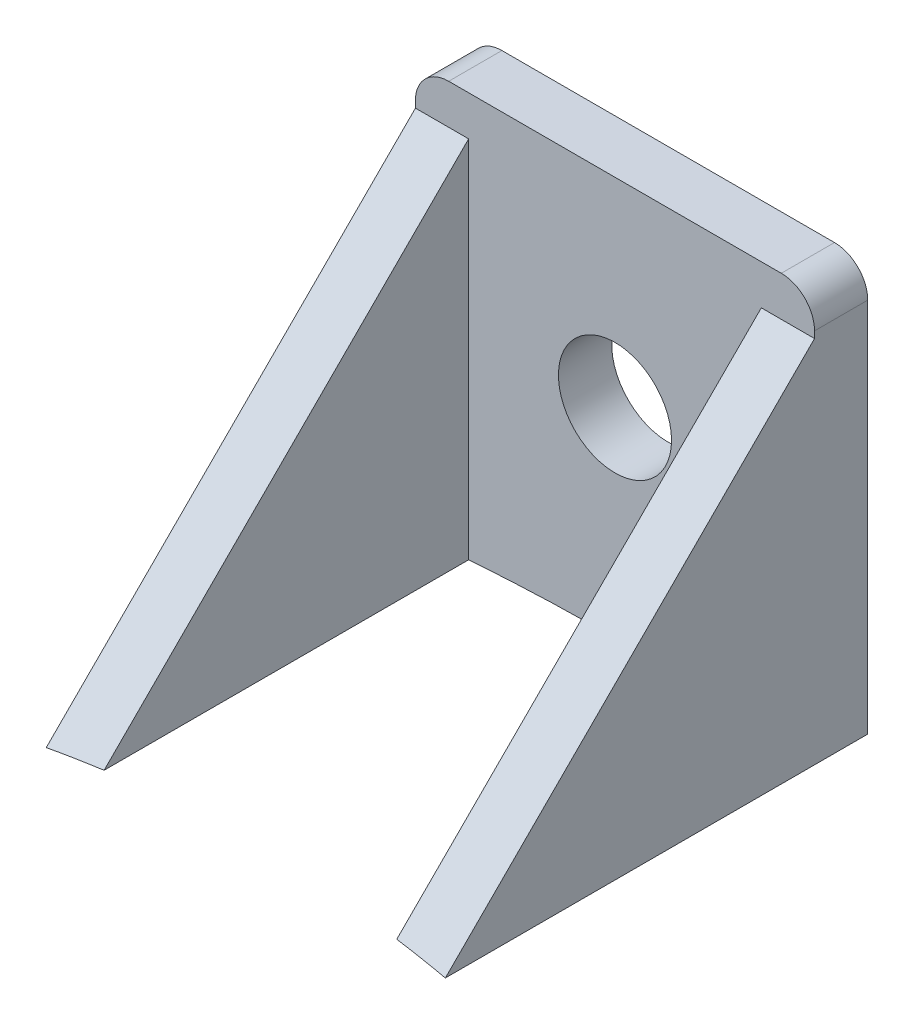
ISO-10303-21;
HEADER;
FILE_DESCRIPTION(('STEP AP214'),'2;1');
FILE_NAME('part.step','',(''),(''),'','','');
FILE_SCHEMA(('AUTOMOTIVE_DESIGN { 1 0 10303 214 1 1 1 1 }'));
ENDSEC;
DATA;
#1=APPLICATION_CONTEXT('core data for automotive mechanical design processes');
#2=APPLICATION_PROTOCOL_DEFINITION('international standard','automotive_design',2000,#1);
#3=PRODUCT_CONTEXT('',#1,'mechanical');
#4=PRODUCT('Part','Part','',(#3));
#5=PRODUCT_RELATED_PRODUCT_CATEGORY('part','',(#4));
#6=PRODUCT_DEFINITION_FORMATION('','',#4);
#7=PRODUCT_DEFINITION_CONTEXT('part definition',#1,'design');
#8=PRODUCT_DEFINITION('design','',#6,#7);
#9=PRODUCT_DEFINITION_SHAPE('','',#8);
#10=(LENGTH_UNIT() NAMED_UNIT(*) SI_UNIT(.MILLI.,.METRE.));
#11=(NAMED_UNIT(*) PLANE_ANGLE_UNIT() SI_UNIT($,.RADIAN.));
#12=(NAMED_UNIT(*) SI_UNIT($,.STERADIAN.) SOLID_ANGLE_UNIT());
#13=UNCERTAINTY_MEASURE_WITH_UNIT(LENGTH_MEASURE(1.E-05),#10,'distance_accuracy_value','');
#14=(GEOMETRIC_REPRESENTATION_CONTEXT(3) GLOBAL_UNCERTAINTY_ASSIGNED_CONTEXT((#13)) GLOBAL_UNIT_ASSIGNED_CONTEXT((#10,
#11,#12)) REPRESENTATION_CONTEXT('',''));
#15=CARTESIAN_POINT('',(0.,0.,0.));
#16=DIRECTION('',(0.,0.,1.));
#17=DIRECTION('',(1.,0.,0.));
#18=AXIS2_PLACEMENT_3D('',#15,#16,#17);
#19=CARTESIAN_POINT('',(0.,0.,4.));
#20=DIRECTION('',(0.,0.,1.));
#21=DIRECTION('',(1.,0.,0.));
#22=AXIS2_PLACEMENT_3D('',#19,#20,#21);
#23=PLANE('',#22);
#24=CARTESIAN_POINT('',(0.,-165.,4.));
#25=DIRECTION('',(0.,0.,1.));
#26=DIRECTION('',(1.,0.,0.));
#27=AXIS2_PLACEMENT_3D('',#24,#25,#26);
#28=CIRCLE('',#27,150.);
#29=CARTESIAN_POINT('',(11.,-15.4038770555867,3.99999999999998));
#30=VERTEX_POINT('',#29);
#31=CARTESIAN_POINT('',(-11.,-15.4038770555867,4.));
#32=VERTEX_POINT('',#31);
#33=EDGE_CURVE('E50',#30,#32,#28,.T.);
#34=ORIENTED_EDGE('',*,*,#33,.F.);
#35=DIRECTION('',(0.,1.,0.));
#36=VECTOR('',#35,1.);
#37=CARTESIAN_POINT('',(11.,-18.,4.));
#38=LINE('',#37,#36);
#39=CARTESIAN_POINT('',(11.,11.9999999999997,4.));
#40=VERTEX_POINT('',#39);
#41=EDGE_CURVE('E37',#30,#40,#38,.T.);
#42=ORIENTED_EDGE('',*,*,#41,.T.);
#43=DIRECTION('',(1.,0.,0.));
#44=VECTOR('',#43,1.);
#45=CARTESIAN_POINT('',(11.,11.9999999999997,4.));
#46=LINE('',#45,#44);
#47=CARTESIAN_POINT('',(15.,11.9999999999997,4.));
#48=VERTEX_POINT('',#47);
#49=EDGE_CURVE('E174',#40,#48,#46,.T.);
#50=ORIENTED_EDGE('',*,*,#49,.T.);
#51=DIRECTION('',(0.,1.,0.));
#52=VECTOR('',#51,1.);
#53=CARTESIAN_POINT('',(15.,15.,4.));
#54=LINE('',#53,#52);
#55=CARTESIAN_POINT('',(15.,12.5,4.));
#56=VERTEX_POINT('',#55);
#57=EDGE_CURVE('E165',#48,#56,#54,.T.);
#58=ORIENTED_EDGE('',*,*,#57,.T.);
#59=CARTESIAN_POINT('',(12.5,12.5,4.));
#60=DIRECTION('',(0.,0.,1.));
#61=DIRECTION('',(1.,0.,0.));
#62=AXIS2_PLACEMENT_3D('',#59,#60,#61);
#63=CIRCLE('',#62,2.5);
#64=CARTESIAN_POINT('',(12.5,15.,4.));
#65=VERTEX_POINT('',#64);
#66=EDGE_CURVE('E162',#56,#65,#63,.T.);
#67=ORIENTED_EDGE('',*,*,#66,.T.);
#68=DIRECTION('',(-1.,0.,0.));
#69=VECTOR('',#68,1.);
#70=CARTESIAN_POINT('',(-15.,15.,4.));
#71=LINE('',#70,#69);
#72=CARTESIAN_POINT('',(-12.5,15.,4.));
#73=VERTEX_POINT('',#72);
#74=EDGE_CURVE('E142',#65,#73,#71,.T.);
#75=ORIENTED_EDGE('',*,*,#74,.T.);
#76=CARTESIAN_POINT('',(-12.5,12.5,4.));
#77=DIRECTION('',(0.,0.,1.));
#78=DIRECTION('',(1.,0.,0.));
#79=AXIS2_PLACEMENT_3D('',#76,#77,#78);
#80=CIRCLE('',#79,2.5);
#81=CARTESIAN_POINT('',(-15.,12.5,4.));
#82=VERTEX_POINT('',#81);
#83=EDGE_CURVE('E160',#73,#82,#80,.T.);
#84=ORIENTED_EDGE('',*,*,#83,.T.);
#85=DIRECTION('',(0.,-1.,0.));
#86=VECTOR('',#85,1.);
#87=CARTESIAN_POINT('',(-15.,15.,4.));
#88=LINE('',#87,#86);
#89=CARTESIAN_POINT('',(-15.,11.9999999999997,4.));
#90=VERTEX_POINT('',#89);
#91=EDGE_CURVE('E147',#82,#90,#88,.T.);
#92=ORIENTED_EDGE('',*,*,#91,.T.);
#93=DIRECTION('',(-1.,0.,0.));
#94=VECTOR('',#93,1.);
#95=CARTESIAN_POINT('',(-11.,11.9999999999997,4.));
#96=LINE('',#95,#94);
#97=CARTESIAN_POINT('',(-11.,11.9999999999997,4.));
#98=VERTEX_POINT('',#97);
#99=EDGE_CURVE('E193',#98,#90,#96,.T.);
#100=ORIENTED_EDGE('',*,*,#99,.F.);
#101=DIRECTION('',(0.,-1.,0.));
#102=VECTOR('',#101,1.);
#103=CARTESIAN_POINT('',(-11.,11.9999999999997,4.));
#104=LINE('',#103,#102);
#105=EDGE_CURVE('E195',#98,#32,#104,.T.);
#106=ORIENTED_EDGE('',*,*,#105,.T.);
#107=EDGE_LOOP('',(#34,#42,#50,#58,#67,#75,#84,#92,#100,#106));
#108=FACE_BOUND('',#107,.T.);
#109=CARTESIAN_POINT('',(0.,0.,4.));
#110=DIRECTION('',(0.,0.,1.));
#111=DIRECTION('',(1.,0.,0.));
#112=AXIS2_PLACEMENT_3D('',#109,#110,#111);
#113=CIRCLE('',#112,4.25);
#114=CARTESIAN_POINT('',(4.25,0.,4.));
#115=VERTEX_POINT('',#114);
#116=EDGE_CURVE('E134',#115,#115,#113,.T.);
#117=ORIENTED_EDGE('',*,*,#116,.F.);
#118=EDGE_LOOP('',(#117));
#119=FACE_BOUND('',#118,.T.);
#120=ADVANCED_FACE('F33',(#108,#119),#23,.T.);
#121=CARTESIAN_POINT('',(0.,0.,0.));
#122=DIRECTION('',(0.,0.,1.));
#123=DIRECTION('',(1.,0.,0.));
#124=AXIS2_PLACEMENT_3D('',#121,#122,#123);
#125=PLANE('',#124);
#126=DIRECTION('',(0.,1.,0.));
#127=VECTOR('',#126,1.);
#128=CARTESIAN_POINT('',(15.,15.,0.));
#129=LINE('',#128,#127);
#130=CARTESIAN_POINT('',(15.,-15.7518844340069,0.));
#131=VERTEX_POINT('',#130);
#132=CARTESIAN_POINT('',(15.,12.5,0.));
#133=VERTEX_POINT('',#132);
#134=EDGE_CURVE('E128',#131,#133,#129,.T.);
#135=ORIENTED_EDGE('',*,*,#134,.F.);
#136=CARTESIAN_POINT('',(0.,-165.,0.));
#137=DIRECTION('',(0.,0.,-1.));
#138=DIRECTION('',(-1.,0.,0.));
#139=AXIS2_PLACEMENT_3D('',#136,#137,#138);
#140=CIRCLE('',#139,150.);
#141=CARTESIAN_POINT('',(-15.,-15.7518844340069,0.));
#142=VERTEX_POINT('',#141);
#143=EDGE_CURVE('E114',#142,#131,#140,.T.);
#144=ORIENTED_EDGE('',*,*,#143,.F.);
#145=DIRECTION('',(0.,-1.,0.));
#146=VECTOR('',#145,1.);
#147=CARTESIAN_POINT('',(-15.,15.,0.));
#148=LINE('',#147,#146);
#149=CARTESIAN_POINT('',(-15.,12.5,0.));
#150=VERTEX_POINT('',#149);
#151=EDGE_CURVE('E126',#150,#142,#148,.T.);
#152=ORIENTED_EDGE('',*,*,#151,.F.);
#153=CARTESIAN_POINT('',(-12.5,12.5,0.));
#154=DIRECTION('',(0.,0.,1.));
#155=DIRECTION('',(1.,0.,0.));
#156=AXIS2_PLACEMENT_3D('',#153,#154,#155);
#157=CIRCLE('',#156,2.5);
#158=CARTESIAN_POINT('',(-12.5,15.,0.));
#159=VERTEX_POINT('',#158);
#160=EDGE_CURVE('E153',#150,#159,#157,.F.);
#161=ORIENTED_EDGE('',*,*,#160,.T.);
#162=DIRECTION('',(-1.,0.,0.));
#163=VECTOR('',#162,1.);
#164=CARTESIAN_POINT('',(-15.,15.,0.));
#165=LINE('',#164,#163);
#166=CARTESIAN_POINT('',(12.5,15.,0.));
#167=VERTEX_POINT('',#166);
#168=EDGE_CURVE('E136',#167,#159,#165,.T.);
#169=ORIENTED_EDGE('',*,*,#168,.F.);
#170=CARTESIAN_POINT('',(12.5,12.5,0.));
#171=DIRECTION('',(0.,0.,1.));
#172=DIRECTION('',(1.,0.,0.));
#173=AXIS2_PLACEMENT_3D('',#170,#171,#172);
#174=CIRCLE('',#173,2.5);
#175=EDGE_CURVE('E155',#167,#133,#174,.F.);
#176=ORIENTED_EDGE('',*,*,#175,.T.);
#177=EDGE_LOOP('',(#135,#144,#152,#161,#169,#176));
#178=FACE_BOUND('',#177,.T.);
#179=CARTESIAN_POINT('',(0.,0.,0.));
#180=DIRECTION('',(0.,0.,1.));
#181=DIRECTION('',(1.,0.,0.));
#182=AXIS2_PLACEMENT_3D('',#179,#180,#181);
#183=CIRCLE('',#182,4.25);
#184=CARTESIAN_POINT('',(4.25,0.,0.));
#185=VERTEX_POINT('',#184);
#186=EDGE_CURVE('E139',#185,#185,#183,.T.);
#187=ORIENTED_EDGE('',*,*,#186,.T.);
#188=EDGE_LOOP('',(#187));
#189=FACE_BOUND('',#188,.T.);
#190=ADVANCED_FACE('F124',(#178,#189),#125,.F.);
#191=CARTESIAN_POINT('',(-15.,15.,4.));
#192=DIRECTION('',(1.,0.,0.));
#193=DIRECTION('',(0.,1.,0.));
#194=AXIS2_PLACEMENT_3D('',#191,#192,#193);
#195=PLANE('',#194);
#196=ORIENTED_EDGE('',*,*,#151,.T.);
#197=DIRECTION('',(0.,0.,-1.));
#198=VECTOR('',#197,1.);
#199=CARTESIAN_POINT('',(-15.,-15.7518844340069,34.000025));
#200=LINE('',#199,#198);
#201=CARTESIAN_POINT('',(-15.,-15.7518844340069,31.7518844340069));
#202=VERTEX_POINT('',#201);
#203=EDGE_CURVE('E111',#142,#202,#200,.F.);
#204=ORIENTED_EDGE('',*,*,#203,.T.);
#205=DIRECTION('',(0.,0.707106781186544,-0.707106781186551));
#206=VECTOR('',#205,1.);
#207=CARTESIAN_POINT('',(-15.,-18.,34.));
#208=LINE('',#207,#206);
#209=EDGE_CURVE('E198',#202,#90,#208,.T.);
#210=ORIENTED_EDGE('',*,*,#209,.T.);
#211=ORIENTED_EDGE('',*,*,#91,.F.);
#212=DIRECTION('',(0.,0.,-1.));
#213=VECTOR('',#212,1.);
#214=CARTESIAN_POINT('',(-15.,12.5,4.));
#215=LINE('',#214,#213);
#216=EDGE_CURVE('E43',#82,#150,#215,.T.);
#217=ORIENTED_EDGE('',*,*,#216,.T.);
#218=EDGE_LOOP('',(#196,#204,#210,#211,#217));
#219=FACE_BOUND('',#218,.T.);
#220=ADVANCED_FACE('F131',(#219),#195,.F.);
#221=CARTESIAN_POINT('',(15.,15.,4.));
#222=DIRECTION('',(-1.,0.,0.));
#223=DIRECTION('',(0.,0.,1.));
#224=AXIS2_PLACEMENT_3D('',#221,#222,#223);
#225=PLANE('',#224);
#226=DIRECTION('',(0.,-0.707106781186544,0.707106781186551));
#227=VECTOR('',#226,1.);
#228=CARTESIAN_POINT('',(15.,-18.,34.));
#229=LINE('',#228,#227);
#230=CARTESIAN_POINT('',(15.,-15.751884434007,31.7518844340069));
#231=VERTEX_POINT('',#230);
#232=EDGE_CURVE('E167',#48,#231,#229,.T.);
#233=ORIENTED_EDGE('',*,*,#232,.T.);
#234=DIRECTION('',(0.,0.,-1.));
#235=VECTOR('',#234,1.);
#236=CARTESIAN_POINT('',(15.,-15.7518844340069,34.000025));
#237=LINE('',#236,#235);
#238=EDGE_CURVE('E199',#231,#131,#237,.T.);
#239=ORIENTED_EDGE('',*,*,#238,.T.);
#240=ORIENTED_EDGE('',*,*,#134,.T.);
#241=DIRECTION('',(0.,0.,-1.));
#242=VECTOR('',#241,1.);
#243=CARTESIAN_POINT('',(15.,12.5,4.));
#244=LINE('',#243,#242);
#245=EDGE_CURVE('E157',#133,#56,#244,.F.);
#246=ORIENTED_EDGE('',*,*,#245,.T.);
#247=ORIENTED_EDGE('',*,*,#57,.F.);
#248=EDGE_LOOP('',(#233,#239,#240,#246,#247));
#249=FACE_BOUND('',#248,.T.);
#250=ADVANCED_FACE('F230',(#249),#225,.F.);
#251=CARTESIAN_POINT('',(-15.,15.,4.));
#252=DIRECTION('',(0.,-1.,0.));
#253=DIRECTION('',(0.,0.,-1.));
#254=AXIS2_PLACEMENT_3D('',#251,#252,#253);
#255=PLANE('',#254);
#256=ORIENTED_EDGE('',*,*,#74,.F.);
#257=DIRECTION('',(0.,0.,-1.));
#258=VECTOR('',#257,1.);
#259=CARTESIAN_POINT('',(12.5,15.,4.));
#260=LINE('',#259,#258);
#261=EDGE_CURVE('E150',#65,#167,#260,.T.);
#262=ORIENTED_EDGE('',*,*,#261,.T.);
#263=ORIENTED_EDGE('',*,*,#168,.T.);
#264=DIRECTION('',(0.,0.,-1.));
#265=VECTOR('',#264,1.);
#266=CARTESIAN_POINT('',(-12.5,15.,4.));
#267=LINE('',#266,#265);
#268=EDGE_CURVE('E148',#159,#73,#267,.F.);
#269=ORIENTED_EDGE('',*,*,#268,.T.);
#270=EDGE_LOOP('',(#256,#262,#263,#269));
#271=FACE_BOUND('',#270,.T.);
#272=ADVANCED_FACE('F224',(#271),#255,.F.);
#273=CARTESIAN_POINT('',(0.,0.,4.));
#274=DIRECTION('',(0.,0.,-1.));
#275=DIRECTION('',(-1.,0.,0.));
#276=AXIS2_PLACEMENT_3D('',#273,#274,#275);
#277=CYLINDRICAL_SURFACE('',#276,4.25);
#278=ORIENTED_EDGE('',*,*,#116,.T.);
#279=EDGE_LOOP('',(#278));
#280=FACE_BOUND('',#279,.T.);
#281=ORIENTED_EDGE('',*,*,#186,.F.);
#282=EDGE_LOOP('',(#281));
#283=FACE_BOUND('',#282,.T.);
#284=ADVANCED_FACE('F246',(#280,#283),#277,.F.);
#285=CARTESIAN_POINT('',(12.5,12.5,4.));
#286=DIRECTION('',(0.,0.,-1.));
#287=DIRECTION('',(-1.,0.,0.));
#288=AXIS2_PLACEMENT_3D('',#285,#286,#287);
#289=CYLINDRICAL_SURFACE('',#288,2.5);
#290=ORIENTED_EDGE('',*,*,#66,.F.);
#291=ORIENTED_EDGE('',*,*,#245,.F.);
#292=ORIENTED_EDGE('',*,*,#175,.F.);
#293=ORIENTED_EDGE('',*,*,#261,.F.);
#294=EDGE_LOOP('',(#290,#291,#292,#293));
#295=FACE_BOUND('',#294,.T.);
#296=ADVANCED_FACE('F228',(#295),#289,.T.);
#297=CARTESIAN_POINT('',(-12.5,12.5,4.));
#298=DIRECTION('',(0.,0.,-1.));
#299=DIRECTION('',(-1.,0.,0.));
#300=AXIS2_PLACEMENT_3D('',#297,#298,#299);
#301=CYLINDRICAL_SURFACE('',#300,2.5);
#302=ORIENTED_EDGE('',*,*,#83,.F.);
#303=ORIENTED_EDGE('',*,*,#268,.F.);
#304=ORIENTED_EDGE('',*,*,#160,.F.);
#305=ORIENTED_EDGE('',*,*,#216,.F.);
#306=EDGE_LOOP('',(#302,#303,#304,#305));
#307=FACE_BOUND('',#306,.T.);
#308=ADVANCED_FACE('F35',(#307),#301,.T.);
#309=CARTESIAN_POINT('',(11.,-18.,34.));
#310=DIRECTION('',(0.,0.707106781186551,0.707106781186544));
#311=DIRECTION('',(0.,-0.707106781186544,0.707106781186551));
#312=AXIS2_PLACEMENT_3D('',#309,#310,#311);
#313=PLANE('',#312);
#314=CARTESIAN_POINT('',(0.,-165.,181.000000000002));
#315=DIRECTION('',(0.,0.707106781186551,0.707106781186544));
#316=DIRECTION('',(0.,0.707106781186544,-0.707106781186551));
#317=AXIS2_PLACEMENT_3D('',#314,#315,#316);
#318=ELLIPSE('',#317,212.132034355965,150.);
#319=CARTESIAN_POINT('',(11.,-15.4038770555867,31.4038770555867));
#320=VERTEX_POINT('',#319);
#321=EDGE_CURVE('E204',#231,#320,#318,.T.);
#322=ORIENTED_EDGE('',*,*,#321,.F.);
#323=ORIENTED_EDGE('',*,*,#232,.F.);
#324=ORIENTED_EDGE('',*,*,#49,.F.);
#325=DIRECTION('',(0.,-0.707106781186544,0.707106781186551));
#326=VECTOR('',#325,1.);
#327=CARTESIAN_POINT('',(11.,-18.,34.));
#328=LINE('',#327,#326);
#329=EDGE_CURVE('E178',#40,#320,#328,.T.);
#330=ORIENTED_EDGE('',*,*,#329,.T.);
#331=EDGE_LOOP('',(#322,#323,#324,#330));
#332=FACE_BOUND('',#331,.T.);
#333=ADVANCED_FACE('F231',(#332),#313,.T.);
#334=CARTESIAN_POINT('',(11.,0.,0.));
#335=DIRECTION('',(1.,0.,0.));
#336=DIRECTION('',(0.,0.,-1.));
#337=AXIS2_PLACEMENT_3D('',#334,#335,#336);
#338=PLANE('',#337);
#339=ORIENTED_EDGE('',*,*,#41,.F.);
#340=DIRECTION('',(0.,0.,-1.));
#341=VECTOR('',#340,1.);
#342=CARTESIAN_POINT('',(11.,-15.4038770555867,34.000025));
#343=LINE('',#342,#341);
#344=EDGE_CURVE('E206',#30,#320,#343,.F.);
#345=ORIENTED_EDGE('',*,*,#344,.T.);
#346=ORIENTED_EDGE('',*,*,#329,.F.);
#347=EDGE_LOOP('',(#339,#345,#346));
#348=FACE_BOUND('',#347,.T.);
#349=ADVANCED_FACE('F211',(#348),#338,.F.);
#350=CARTESIAN_POINT('',(-11.,-18.,34.));
#351=DIRECTION('',(0.,0.707106781186551,0.707106781186544));
#352=DIRECTION('',(0.,-0.707106781186544,0.707106781186551));
#353=AXIS2_PLACEMENT_3D('',#350,#351,#352);
#354=PLANE('',#353);
#355=CARTESIAN_POINT('',(0.,-165.,181.000000000002));
#356=DIRECTION('',(0.,0.707106781186551,0.707106781186544));
#357=DIRECTION('',(0.,0.707106781186544,-0.707106781186551));
#358=AXIS2_PLACEMENT_3D('',#355,#356,#357);
#359=ELLIPSE('',#358,212.132034355966,150.);
#360=CARTESIAN_POINT('',(-11.,-15.4038770555867,31.4038770555867));
#361=VERTEX_POINT('',#360);
#362=EDGE_CURVE('E116',#361,#202,#359,.T.);
#363=ORIENTED_EDGE('',*,*,#362,.F.);
#364=DIRECTION('',(0.,0.707106781186544,-0.707106781186551));
#365=VECTOR('',#364,1.);
#366=CARTESIAN_POINT('',(-11.,-18.,34.));
#367=LINE('',#366,#365);
#368=EDGE_CURVE('E57',#361,#98,#367,.T.);
#369=ORIENTED_EDGE('',*,*,#368,.T.);
#370=ORIENTED_EDGE('',*,*,#99,.T.);
#371=ORIENTED_EDGE('',*,*,#209,.F.);
#372=EDGE_LOOP('',(#363,#369,#370,#371));
#373=FACE_BOUND('',#372,.T.);
#374=ADVANCED_FACE('F216',(#373),#354,.T.);
#375=CARTESIAN_POINT('',(-11.,0.,0.));
#376=DIRECTION('',(-1.,0.,0.));
#377=DIRECTION('',(0.,-1.,0.));
#378=AXIS2_PLACEMENT_3D('',#375,#376,#377);
#379=PLANE('',#378);
#380=ORIENTED_EDGE('',*,*,#368,.F.);
#381=DIRECTION('',(0.,0.,-1.));
#382=VECTOR('',#381,1.);
#383=CARTESIAN_POINT('',(-11.,-15.4038770555867,34.000025));
#384=LINE('',#383,#382);
#385=EDGE_CURVE('E11',#361,#32,#384,.T.);
#386=ORIENTED_EDGE('',*,*,#385,.T.);
#387=ORIENTED_EDGE('',*,*,#105,.F.);
#388=EDGE_LOOP('',(#380,#386,#387));
#389=FACE_BOUND('',#388,.T.);
#390=ADVANCED_FACE('F215',(#389),#379,.F.);
#391=CARTESIAN_POINT('',(0.,-165.,34.000025));
#392=DIRECTION('',(0.,0.,-1.));
#393=DIRECTION('',(-1.,0.,0.));
#394=AXIS2_PLACEMENT_3D('',#391,#392,#393);
#395=CYLINDRICAL_SURFACE('',#394,150.);
#396=ORIENTED_EDGE('',*,*,#321,.T.);
#397=ORIENTED_EDGE('',*,*,#344,.F.);
#398=ORIENTED_EDGE('',*,*,#33,.T.);
#399=ORIENTED_EDGE('',*,*,#385,.F.);
#400=ORIENTED_EDGE('',*,*,#362,.T.);
#401=ORIENTED_EDGE('',*,*,#203,.F.);
#402=ORIENTED_EDGE('',*,*,#143,.T.);
#403=ORIENTED_EDGE('',*,*,#238,.F.);
#404=EDGE_LOOP('',(#396,#397,#398,#399,#400,#401,#402,#403));
#405=FACE_BOUND('',#404,.T.);
#406=ADVANCED_FACE('F113',(#405),#395,.F.);
#407=CLOSED_SHELL('',(#120,#190,#220,#250,#272,#284,#296,#308,#333,#349,#374,#390,#406));
#408=MANIFOLD_SOLID_BREP('B2',#407);
#409=ADVANCED_BREP_SHAPE_REPRESENTATION('',(#18,#408),#14);
#410=SHAPE_DEFINITION_REPRESENTATION(#9,#409);
ENDSEC;
END-ISO-10303-21;
